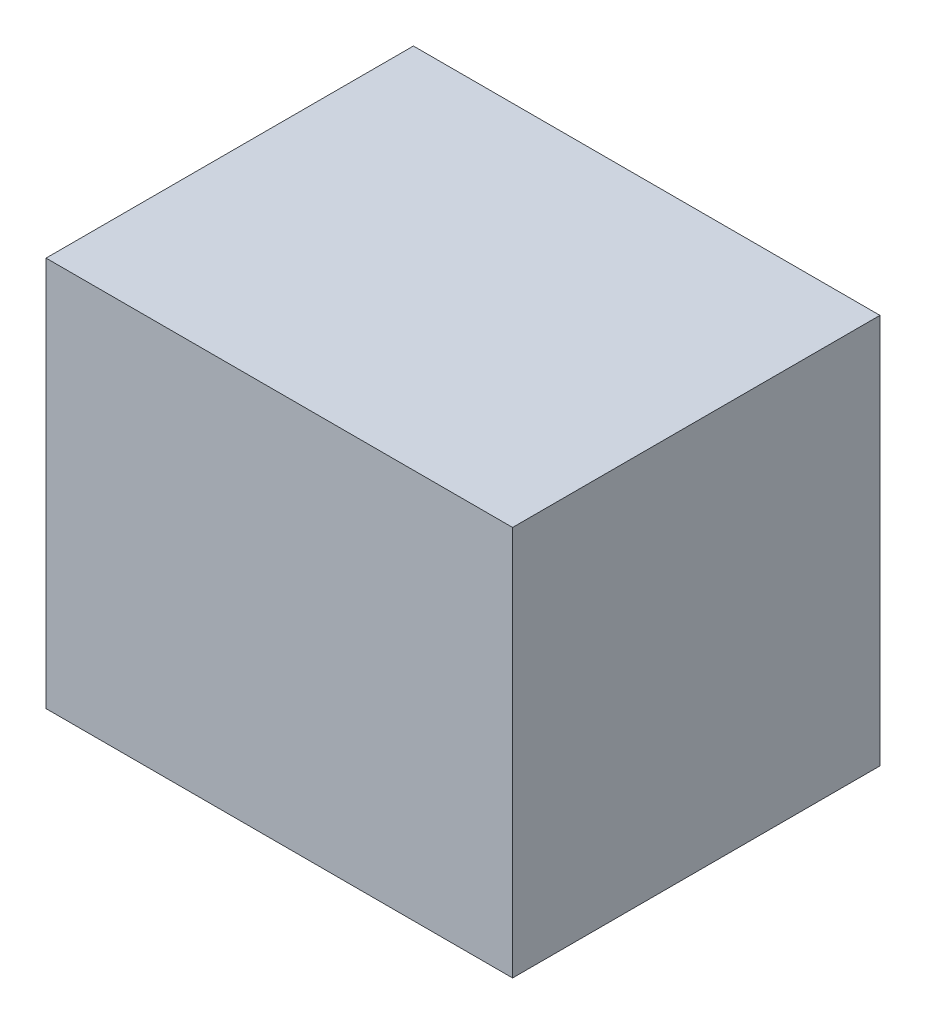
ISO-10303-21;
HEADER;
FILE_DESCRIPTION(('STEP AP214'),'2;1');
FILE_NAME('part.step','',(''),(''),'','','');
FILE_SCHEMA(('AUTOMOTIVE_DESIGN { 1 0 10303 214 1 1 1 1 }'));
ENDSEC;
DATA;
#1=APPLICATION_CONTEXT('core data for automotive mechanical design processes');
#2=APPLICATION_PROTOCOL_DEFINITION('international standard','automotive_design',2000,#1);
#3=PRODUCT_CONTEXT('',#1,'mechanical');
#4=PRODUCT('Part','Part','',(#3));
#5=PRODUCT_RELATED_PRODUCT_CATEGORY('part','',(#4));
#6=PRODUCT_DEFINITION_FORMATION('','',#4);
#7=PRODUCT_DEFINITION_CONTEXT('part definition',#1,'design');
#8=PRODUCT_DEFINITION('design','',#6,#7);
#9=PRODUCT_DEFINITION_SHAPE('','',#8);
#10=(LENGTH_UNIT() NAMED_UNIT(*) SI_UNIT(.MILLI.,.METRE.));
#11=(NAMED_UNIT(*) PLANE_ANGLE_UNIT() SI_UNIT($,.RADIAN.));
#12=(NAMED_UNIT(*) SI_UNIT($,.STERADIAN.) SOLID_ANGLE_UNIT());
#13=UNCERTAINTY_MEASURE_WITH_UNIT(LENGTH_MEASURE(1.E-05),#10,'distance_accuracy_value','');
#14=(GEOMETRIC_REPRESENTATION_CONTEXT(3) GLOBAL_UNCERTAINTY_ASSIGNED_CONTEXT((#13)) GLOBAL_UNIT_ASSIGNED_CONTEXT((#10,
#11,#12)) REPRESENTATION_CONTEXT('',''));
#15=CARTESIAN_POINT('',(0.,0.,0.));
#16=DIRECTION('',(0.,0.,1.));
#17=DIRECTION('',(1.,0.,0.));
#18=AXIS2_PLACEMENT_3D('',#15,#16,#17);
#19=CARTESIAN_POINT('',(0.6985,0.5842,1.0999978));
#20=DIRECTION('',(0.,0.,-1.));
#21=DIRECTION('',(-1.,0.,0.));
#22=AXIS2_PLACEMENT_3D('',#19,#20,#21);
#23=PLANE('',#22);
#24=DIRECTION('',(0.,1.,0.));
#25=VECTOR('',#24,1.);
#26=CARTESIAN_POINT('',(-0.6985,0.5842,1.0999978));
#27=LINE('',#26,#25);
#28=CARTESIAN_POINT('',(-0.6985,0.5842,1.0999978));
#29=VERTEX_POINT('',#28);
#30=CARTESIAN_POINT('',(-0.6985,-0.5842,1.0999978));
#31=VERTEX_POINT('',#30);
#32=EDGE_CURVE('E55',#29,#31,#27,.F.);
#33=ORIENTED_EDGE('',*,*,#32,.T.);
#34=DIRECTION('',(1.,0.,0.));
#35=VECTOR('',#34,1.);
#36=CARTESIAN_POINT('',(-0.6985,-0.5842,1.0999978));
#37=LINE('',#36,#35);
#38=CARTESIAN_POINT('',(0.6985,-0.5842,1.0999978));
#39=VERTEX_POINT('',#38);
#40=EDGE_CURVE('E57',#31,#39,#37,.T.);
#41=ORIENTED_EDGE('',*,*,#40,.T.);
#42=DIRECTION('',(0.,1.,0.));
#43=VECTOR('',#42,1.);
#44=CARTESIAN_POINT('',(0.6985,-0.5842,1.0999978));
#45=LINE('',#44,#43);
#46=CARTESIAN_POINT('',(0.6985,0.5842,1.0999978));
#47=VERTEX_POINT('',#46);
#48=EDGE_CURVE('E20',#39,#47,#45,.T.);
#49=ORIENTED_EDGE('',*,*,#48,.T.);
#50=DIRECTION('',(1.,0.,0.));
#51=VECTOR('',#50,1.);
#52=CARTESIAN_POINT('',(0.6985,0.5842,1.0999978));
#53=LINE('',#52,#51);
#54=EDGE_CURVE('E80',#47,#29,#53,.F.);
#55=ORIENTED_EDGE('',*,*,#54,.T.);
#56=EDGE_LOOP('',(#33,#41,#49,#55));
#57=FACE_BOUND('',#56,.T.);
#58=ADVANCED_FACE('F17',(#57),#23,.F.);
#59=CARTESIAN_POINT('',(0.6985,-0.5842,0.));
#60=DIRECTION('',(-1.,0.,0.));
#61=DIRECTION('',(0.,0.,1.));
#62=AXIS2_PLACEMENT_3D('',#59,#60,#61);
#63=PLANE('',#62);
#64=DIRECTION('',(0.,0.,-1.));
#65=VECTOR('',#64,1.);
#66=CARTESIAN_POINT('',(0.6985,0.5842,0.));
#67=LINE('',#66,#65);
#68=CARTESIAN_POINT('',(0.6985,0.5842,0.));
#69=VERTEX_POINT('',#68);
#70=EDGE_CURVE('E68',#69,#47,#67,.F.);
#71=ORIENTED_EDGE('',*,*,#70,.T.);
#72=ORIENTED_EDGE('',*,*,#48,.F.);
#73=DIRECTION('',(0.,0.,1.));
#74=VECTOR('',#73,1.);
#75=CARTESIAN_POINT('',(0.6985,-0.5842,0.));
#76=LINE('',#75,#74);
#77=CARTESIAN_POINT('',(0.6985,-0.5842,0.));
#78=VERTEX_POINT('',#77);
#79=EDGE_CURVE('E63',#39,#78,#76,.F.);
#80=ORIENTED_EDGE('',*,*,#79,.T.);
#81=DIRECTION('',(0.,1.,0.));
#82=VECTOR('',#81,1.);
#83=CARTESIAN_POINT('',(0.6985,0.5842,0.));
#84=LINE('',#83,#82);
#85=EDGE_CURVE('E83',#69,#78,#84,.F.);
#86=ORIENTED_EDGE('',*,*,#85,.F.);
#87=EDGE_LOOP('',(#71,#72,#80,#86));
#88=FACE_BOUND('',#87,.T.);
#89=ADVANCED_FACE('F65',(#88),#63,.F.);
#90=CARTESIAN_POINT('',(-0.6985,-0.5842,0.));
#91=DIRECTION('',(0.,1.,0.));
#92=DIRECTION('',(0.,0.,1.));
#93=AXIS2_PLACEMENT_3D('',#90,#91,#92);
#94=PLANE('',#93);
#95=ORIENTED_EDGE('',*,*,#79,.F.);
#96=ORIENTED_EDGE('',*,*,#40,.F.);
#97=DIRECTION('',(0.,0.,-1.));
#98=VECTOR('',#97,1.);
#99=CARTESIAN_POINT('',(-0.6985,-0.5842,0.));
#100=LINE('',#99,#98);
#101=CARTESIAN_POINT('',(-0.6985,-0.5842,0.));
#102=VERTEX_POINT('',#101);
#103=EDGE_CURVE('E75',#31,#102,#100,.T.);
#104=ORIENTED_EDGE('',*,*,#103,.T.);
#105=DIRECTION('',(-1.,0.,0.));
#106=VECTOR('',#105,1.);
#107=CARTESIAN_POINT('',(0.6985,-0.5842,0.));
#108=LINE('',#107,#106);
#109=EDGE_CURVE('E72',#78,#102,#108,.T.);
#110=ORIENTED_EDGE('',*,*,#109,.F.);
#111=EDGE_LOOP('',(#95,#96,#104,#110));
#112=FACE_BOUND('',#111,.T.);
#113=ADVANCED_FACE('F70',(#112),#94,.F.);
#114=CARTESIAN_POINT('',(-0.6985,0.5842,0.));
#115=DIRECTION('',(1.,0.,0.));
#116=DIRECTION('',(0.,0.,-1.));
#117=AXIS2_PLACEMENT_3D('',#114,#115,#116);
#118=PLANE('',#117);
#119=ORIENTED_EDGE('',*,*,#103,.F.);
#120=ORIENTED_EDGE('',*,*,#32,.F.);
#121=DIRECTION('',(0.,0.,-1.));
#122=VECTOR('',#121,1.);
#123=CARTESIAN_POINT('',(-0.6985,0.5842,0.));
#124=LINE('',#123,#122);
#125=CARTESIAN_POINT('',(-0.6985,0.5842,0.));
#126=VERTEX_POINT('',#125);
#127=EDGE_CURVE('E35',#29,#126,#124,.T.);
#128=ORIENTED_EDGE('',*,*,#127,.T.);
#129=DIRECTION('',(0.,1.,0.));
#130=VECTOR('',#129,1.);
#131=CARTESIAN_POINT('',(-0.6985,0.5842,0.));
#132=LINE('',#131,#130);
#133=EDGE_CURVE('E26',#102,#126,#132,.T.);
#134=ORIENTED_EDGE('',*,*,#133,.F.);
#135=EDGE_LOOP('',(#119,#120,#128,#134));
#136=FACE_BOUND('',#135,.T.);
#137=ADVANCED_FACE('F89',(#136),#118,.F.);
#138=CARTESIAN_POINT('',(0.6985,0.5842,0.));
#139=DIRECTION('',(0.,-1.,0.));
#140=DIRECTION('',(0.,0.,-1.));
#141=AXIS2_PLACEMENT_3D('',#138,#139,#140);
#142=PLANE('',#141);
#143=ORIENTED_EDGE('',*,*,#127,.F.);
#144=ORIENTED_EDGE('',*,*,#54,.F.);
#145=ORIENTED_EDGE('',*,*,#70,.F.);
#146=DIRECTION('',(-1.,0.,0.));
#147=VECTOR('',#146,1.);
#148=CARTESIAN_POINT('',(0.6985,0.5842,0.));
#149=LINE('',#148,#147);
#150=EDGE_CURVE('E11',#126,#69,#149,.F.);
#151=ORIENTED_EDGE('',*,*,#150,.F.);
#152=EDGE_LOOP('',(#143,#144,#145,#151));
#153=FACE_BOUND('',#152,.T.);
#154=ADVANCED_FACE('F91',(#153),#142,.F.);
#155=CARTESIAN_POINT('',(0.6985,0.5842,0.));
#156=DIRECTION('',(0.,0.,-1.));
#157=DIRECTION('',(-1.,0.,0.));
#158=AXIS2_PLACEMENT_3D('',#155,#156,#157);
#159=PLANE('',#158);
#160=ORIENTED_EDGE('',*,*,#133,.T.);
#161=ORIENTED_EDGE('',*,*,#150,.T.);
#162=ORIENTED_EDGE('',*,*,#85,.T.);
#163=ORIENTED_EDGE('',*,*,#109,.T.);
#164=EDGE_LOOP('',(#160,#161,#162,#163));
#165=FACE_BOUND('',#164,.T.);
#166=ADVANCED_FACE('F88',(#165),#159,.T.);
#167=CLOSED_SHELL('',(#58,#89,#113,#137,#154,#166));
#168=MANIFOLD_SOLID_BREP('B1',#167);
#169=ADVANCED_BREP_SHAPE_REPRESENTATION('',(#18,#168),#14);
#170=SHAPE_DEFINITION_REPRESENTATION(#9,#169);
ENDSEC;
END-ISO-10303-21;
